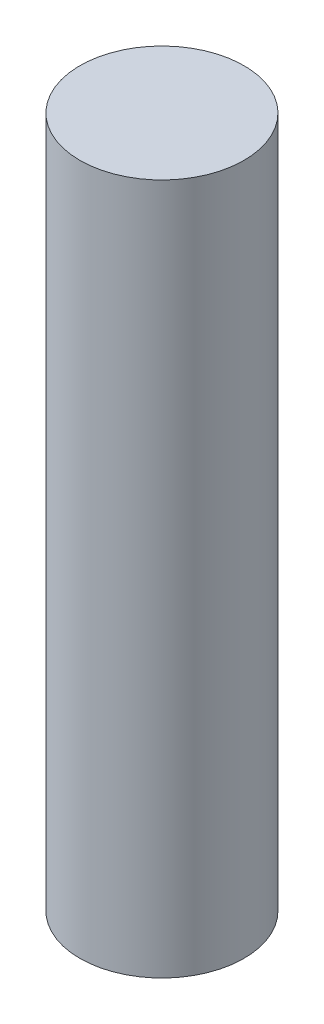
ISO-10303-21;
HEADER;
FILE_DESCRIPTION(('STEP AP214'),'2;1');
FILE_NAME('part.step','',(''),(''),'','','');
FILE_SCHEMA(('AUTOMOTIVE_DESIGN { 1 0 10303 214 1 1 1 1 }'));
ENDSEC;
DATA;
#1=APPLICATION_CONTEXT('core data for automotive mechanical design processes');
#2=APPLICATION_PROTOCOL_DEFINITION('international standard','automotive_design',2000,#1);
#3=PRODUCT_CONTEXT('',#1,'mechanical');
#4=PRODUCT('Part','Part','',(#3));
#5=PRODUCT_RELATED_PRODUCT_CATEGORY('part','',(#4));
#6=PRODUCT_DEFINITION_FORMATION('','',#4);
#7=PRODUCT_DEFINITION_CONTEXT('part definition',#1,'design');
#8=PRODUCT_DEFINITION('design','',#6,#7);
#9=PRODUCT_DEFINITION_SHAPE('','',#8);
#10=(LENGTH_UNIT() NAMED_UNIT(*) SI_UNIT(.MILLI.,.METRE.));
#11=(NAMED_UNIT(*) PLANE_ANGLE_UNIT() SI_UNIT($,.RADIAN.));
#12=(NAMED_UNIT(*) SI_UNIT($,.STERADIAN.) SOLID_ANGLE_UNIT());
#13=UNCERTAINTY_MEASURE_WITH_UNIT(LENGTH_MEASURE(1.E-05),#10,'distance_accuracy_value','');
#14=(GEOMETRIC_REPRESENTATION_CONTEXT(3) GLOBAL_UNCERTAINTY_ASSIGNED_CONTEXT((#13)) GLOBAL_UNIT_ASSIGNED_CONTEXT((#10,
#11,#12)) REPRESENTATION_CONTEXT('',''));
#15=CARTESIAN_POINT('',(0.,0.,0.));
#16=DIRECTION('',(0.,0.,1.));
#17=DIRECTION('',(1.,0.,0.));
#18=AXIS2_PLACEMENT_3D('',#15,#16,#17);
#19=CARTESIAN_POINT('',(-40.4789200204917,37.9,-21.8425855556118));
#20=DIRECTION('',(0.,-1.,0.));
#21=DIRECTION('',(0.,0.,-1.));
#22=AXIS2_PLACEMENT_3D('',#19,#20,#21);
#23=CYLINDRICAL_SURFACE('',#22,4.5);
#24=CARTESIAN_POINT('',(-40.4789200204917,37.9,-21.8425855556118));
#25=DIRECTION('',(0.,1.,0.));
#26=DIRECTION('',(0.,0.,1.));
#27=AXIS2_PLACEMENT_3D('',#24,#25,#26);
#28=CIRCLE('',#27,4.5);
#29=CARTESIAN_POINT('',(-40.4789200204917,37.9,-17.3425855556118));
#30=VERTEX_POINT('',#29);
#31=EDGE_CURVE('E10',#30,#30,#28,.T.);
#32=ORIENTED_EDGE('',*,*,#31,.F.);
#33=EDGE_LOOP('',(#32));
#34=FACE_BOUND('',#33,.T.);
#35=CARTESIAN_POINT('',(-40.4789200204917,0.,-21.8425855556118));
#36=DIRECTION('',(0.,1.,0.));
#37=DIRECTION('',(0.,0.,1.));
#38=AXIS2_PLACEMENT_3D('',#35,#36,#37);
#39=CIRCLE('',#38,4.5);
#40=CARTESIAN_POINT('',(-40.4789200204917,0.,-17.3425855556118));
#41=VERTEX_POINT('',#40);
#42=EDGE_CURVE('E40',#41,#41,#39,.T.);
#43=ORIENTED_EDGE('',*,*,#42,.T.);
#44=EDGE_LOOP('',(#43));
#45=FACE_BOUND('',#44,.T.);
#46=ADVANCED_FACE('F37',(#34,#45),#23,.T.);
#47=CARTESIAN_POINT('',(-40.4789200204917,37.9,-21.8425855556118));
#48=DIRECTION('',(0.,1.,0.));
#49=DIRECTION('',(0.,0.,1.));
#50=AXIS2_PLACEMENT_3D('',#47,#48,#49);
#51=PLANE('',#50);
#52=ORIENTED_EDGE('',*,*,#31,.T.);
#53=EDGE_LOOP('',(#52));
#54=FACE_BOUND('',#53,.T.);
#55=ADVANCED_FACE('F54',(#54),#51,.T.);
#56=CARTESIAN_POINT('',(-40.4789200204917,0.,-21.8425855556118));
#57=DIRECTION('',(0.,1.,0.));
#58=DIRECTION('',(0.,0.,1.));
#59=AXIS2_PLACEMENT_3D('',#56,#57,#58);
#60=PLANE('',#59);
#61=ORIENTED_EDGE('',*,*,#42,.F.);
#62=EDGE_LOOP('',(#61));
#63=FACE_BOUND('',#62,.T.);
#64=ADVANCED_FACE('F52',(#63),#60,.F.);
#65=CLOSED_SHELL('',(#46,#55,#64));
#66=MANIFOLD_SOLID_BREP('B2',#65);
#67=ADVANCED_BREP_SHAPE_REPRESENTATION('',(#18,#66),#14);
#68=SHAPE_DEFINITION_REPRESENTATION(#9,#67);
ENDSEC;
END-ISO-10303-21;
